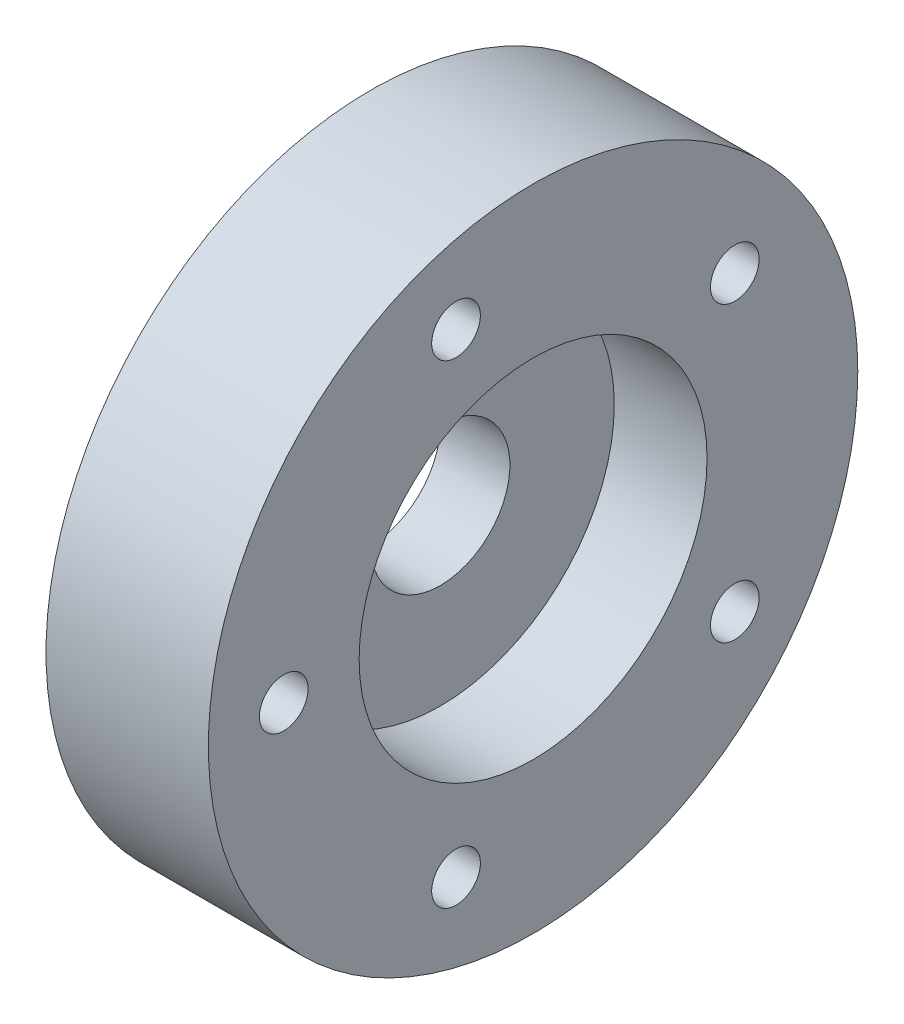
ISO-10303-21;
HEADER;
FILE_DESCRIPTION(('STEP AP214'),'2;1');
FILE_NAME('part.step','',(''),(''),'','','');
FILE_SCHEMA(('AUTOMOTIVE_DESIGN { 1 0 10303 214 1 1 1 1 }'));
ENDSEC;
DATA;
#1=APPLICATION_CONTEXT('core data for automotive mechanical design processes');
#2=APPLICATION_PROTOCOL_DEFINITION('international standard','automotive_design',2000,#1);
#3=PRODUCT_CONTEXT('',#1,'mechanical');
#4=PRODUCT('Part','Part','',(#3));
#5=PRODUCT_RELATED_PRODUCT_CATEGORY('part','',(#4));
#6=PRODUCT_DEFINITION_FORMATION('','',#4);
#7=PRODUCT_DEFINITION_CONTEXT('part definition',#1,'design');
#8=PRODUCT_DEFINITION('design','',#6,#7);
#9=PRODUCT_DEFINITION_SHAPE('','',#8);
#10=(LENGTH_UNIT() NAMED_UNIT(*) SI_UNIT(.MILLI.,.METRE.));
#11=(NAMED_UNIT(*) PLANE_ANGLE_UNIT() SI_UNIT($,.RADIAN.));
#12=(NAMED_UNIT(*) SI_UNIT($,.STERADIAN.) SOLID_ANGLE_UNIT());
#13=UNCERTAINTY_MEASURE_WITH_UNIT(LENGTH_MEASURE(1.E-05),#10,'distance_accuracy_value','');
#14=(GEOMETRIC_REPRESENTATION_CONTEXT(3) GLOBAL_UNCERTAINTY_ASSIGNED_CONTEXT((#13)) GLOBAL_UNIT_ASSIGNED_CONTEXT((#10,
#11,#12)) REPRESENTATION_CONTEXT('',''));
#15=CARTESIAN_POINT('',(0.,0.,0.));
#16=DIRECTION('',(0.,0.,1.));
#17=DIRECTION('',(1.,0.,0.));
#18=AXIS2_PLACEMENT_3D('',#15,#16,#17);
#19=CARTESIAN_POINT('',(14.,0.,0.));
#20=DIRECTION('',(-1.,0.,0.));
#21=DIRECTION('',(0.,0.,1.));
#22=AXIS2_PLACEMENT_3D('',#19,#20,#21);
#23=CYLINDRICAL_SURFACE('',#22,28.);
#24=CARTESIAN_POINT('',(14.,0.,0.));
#25=DIRECTION('',(1.,0.,0.));
#26=DIRECTION('',(0.,0.,-1.));
#27=AXIS2_PLACEMENT_3D('',#24,#25,#26);
#28=CIRCLE('',#27,28.);
#29=CARTESIAN_POINT('',(14.,0.,-28.));
#30=VERTEX_POINT('',#29);
#31=EDGE_CURVE('E185',#30,#30,#28,.T.);
#32=ORIENTED_EDGE('',*,*,#31,.F.);
#33=EDGE_LOOP('',(#32));
#34=FACE_BOUND('',#33,.T.);
#35=CARTESIAN_POINT('',(0.,0.,0.));
#36=DIRECTION('',(1.,0.,0.));
#37=DIRECTION('',(0.,0.,-1.));
#38=AXIS2_PLACEMENT_3D('',#35,#36,#37);
#39=CIRCLE('',#38,28.);
#40=CARTESIAN_POINT('',(0.,0.,-28.));
#41=VERTEX_POINT('',#40);
#42=EDGE_CURVE('E181',#41,#41,#39,.T.);
#43=ORIENTED_EDGE('',*,*,#42,.T.);
#44=EDGE_LOOP('',(#43));
#45=FACE_BOUND('',#44,.T.);
#46=ADVANCED_FACE('F47',(#34,#45),#23,.T.);
#47=CARTESIAN_POINT('',(14.,0.,0.));
#48=DIRECTION('',(1.,0.,0.));
#49=DIRECTION('',(0.,0.,-1.));
#50=AXIS2_PLACEMENT_3D('',#47,#48,#49);
#51=PLANE('',#50);
#52=CARTESIAN_POINT('',(14.,-20.4477151003457,6.6438653790616));
#53=DIRECTION('',(1.,0.,0.));
#54=DIRECTION('',(0.,0.,-1.));
#55=AXIS2_PLACEMENT_3D('',#52,#53,#54);
#56=CIRCLE('',#55,2.09999999999999);
#57=CARTESIAN_POINT('',(14.,-20.4477151003457,4.54386537906161));
#58=VERTEX_POINT('',#57);
#59=EDGE_CURVE('E113',#58,#58,#56,.T.);
#60=ORIENTED_EDGE('',*,*,#59,.F.);
#61=EDGE_LOOP('',(#60));
#62=FACE_BOUND('',#61,.T.);
#63=CARTESIAN_POINT('',(14.,0.,21.5));
#64=DIRECTION('',(1.,0.,0.));
#65=DIRECTION('',(0.,0.,-1.));
#66=AXIS2_PLACEMENT_3D('',#63,#64,#65);
#67=CIRCLE('',#66,2.09999999999999);
#68=CARTESIAN_POINT('',(14.,0.,19.4));
#69=VERTEX_POINT('',#68);
#70=EDGE_CURVE('E112',#69,#69,#67,.T.);
#71=ORIENTED_EDGE('',*,*,#70,.F.);
#72=EDGE_LOOP('',(#71));
#73=FACE_BOUND('',#72,.T.);
#74=CARTESIAN_POINT('',(14.,-12.6373829242883,-17.3938653790613));
#75=DIRECTION('',(1.,0.,0.));
#76=DIRECTION('',(0.,0.,-1.));
#77=AXIS2_PLACEMENT_3D('',#74,#75,#76);
#78=CIRCLE('',#77,2.09999999999999);
#79=CARTESIAN_POINT('',(14.,-12.6373829242883,-19.4938653790612));
#80=VERTEX_POINT('',#79);
#81=EDGE_CURVE('E128',#80,#80,#78,.T.);
#82=ORIENTED_EDGE('',*,*,#81,.F.);
#83=EDGE_LOOP('',(#82));
#84=FACE_BOUND('',#83,.T.);
#85=CARTESIAN_POINT('',(14.,12.6373829242881,-17.3938653790614));
#86=DIRECTION('',(1.,0.,0.));
#87=DIRECTION('',(0.,0.,-1.));
#88=AXIS2_PLACEMENT_3D('',#85,#86,#87);
#89=CIRCLE('',#88,2.09999999999999);
#90=CARTESIAN_POINT('',(14.,12.6373829242881,-19.4938653790614));
#91=VERTEX_POINT('',#90);
#92=EDGE_CURVE('E136',#91,#91,#89,.T.);
#93=ORIENTED_EDGE('',*,*,#92,.F.);
#94=EDGE_LOOP('',(#93));
#95=FACE_BOUND('',#94,.T.);
#96=CARTESIAN_POINT('',(14.,20.4477151003458,6.64386537906131));
#97=DIRECTION('',(1.,0.,0.));
#98=DIRECTION('',(0.,0.,-1.));
#99=AXIS2_PLACEMENT_3D('',#96,#97,#98);
#100=CIRCLE('',#99,2.09999999999999);
#101=CARTESIAN_POINT('',(14.,20.4477151003458,4.54386537906132));
#102=VERTEX_POINT('',#101);
#103=EDGE_CURVE('E144',#102,#102,#100,.T.);
#104=ORIENTED_EDGE('',*,*,#103,.F.);
#105=EDGE_LOOP('',(#104));
#106=FACE_BOUND('',#105,.T.);
#107=CARTESIAN_POINT('',(14.,0.,0.));
#108=DIRECTION('',(1.,0.,0.));
#109=DIRECTION('',(0.,0.,-1.));
#110=AXIS2_PLACEMENT_3D('',#107,#108,#109);
#111=CIRCLE('',#110,15.);
#112=CARTESIAN_POINT('',(14.,0.,-15.));
#113=VERTEX_POINT('',#112);
#114=EDGE_CURVE('E169',#113,#113,#111,.T.);
#115=ORIENTED_EDGE('',*,*,#114,.F.);
#116=EDGE_LOOP('',(#115));
#117=FACE_BOUND('',#116,.T.);
#118=ORIENTED_EDGE('',*,*,#31,.T.);
#119=EDGE_LOOP('',(#118));
#120=FACE_BOUND('',#119,.T.);
#121=ADVANCED_FACE('F223',(#62,#73,#84,#95,#106,#117,#120),#51,.T.);
#122=CARTESIAN_POINT('',(0.,0.,0.));
#123=DIRECTION('',(1.,0.,0.));
#124=DIRECTION('',(0.,0.,-1.));
#125=AXIS2_PLACEMENT_3D('',#122,#123,#124);
#126=PLANE('',#125);
#127=DIRECTION('',(0.,1.,0.));
#128=VECTOR('',#127,1.);
#129=CARTESIAN_POINT('',(0.,2.,7.5));
#130=LINE('',#129,#128);
#131=CARTESIAN_POINT('',(0.,-2.,7.5));
#132=VERTEX_POINT('',#131);
#133=CARTESIAN_POINT('',(0.,2.,7.5));
#134=VERTEX_POINT('',#133);
#135=EDGE_CURVE('E154',#132,#134,#130,.T.);
#136=ORIENTED_EDGE('',*,*,#135,.F.);
#137=DIRECTION('',(0.,0.,1.));
#138=VECTOR('',#137,1.);
#139=CARTESIAN_POINT('',(0.,-2.,7.5));
#140=LINE('',#139,#138);
#141=CARTESIAN_POINT('',(0.,-2.,5.65685424949238));
#142=VERTEX_POINT('',#141);
#143=EDGE_CURVE('E62',#142,#132,#140,.T.);
#144=ORIENTED_EDGE('',*,*,#143,.F.);
#145=CARTESIAN_POINT('',(0.,0.,0.));
#146=DIRECTION('',(-1.,0.,0.));
#147=DIRECTION('',(0.,0.,1.));
#148=AXIS2_PLACEMENT_3D('',#145,#146,#147);
#149=CIRCLE('',#148,6.);
#150=CARTESIAN_POINT('',(0.,2.,5.65685424949238));
#151=VERTEX_POINT('',#150);
#152=EDGE_CURVE('E161',#151,#142,#149,.T.);
#153=ORIENTED_EDGE('',*,*,#152,.F.);
#154=DIRECTION('',(0.,0.,-1.));
#155=VECTOR('',#154,1.);
#156=CARTESIAN_POINT('',(0.,2.,7.5));
#157=LINE('',#156,#155);
#158=EDGE_CURVE('E157',#134,#151,#157,.T.);
#159=ORIENTED_EDGE('',*,*,#158,.F.);
#160=EDGE_LOOP('',(#136,#144,#153,#159));
#161=FACE_BOUND('',#160,.T.);
#162=ORIENTED_EDGE('',*,*,#42,.F.);
#163=EDGE_LOOP('',(#162));
#164=FACE_BOUND('',#163,.T.);
#165=ADVANCED_FACE('F219',(#161,#164),#126,.F.);
#166=CARTESIAN_POINT('',(6.,0.,0.));
#167=DIRECTION('',(1.,0.,0.));
#168=DIRECTION('',(0.,0.,-1.));
#169=AXIS2_PLACEMENT_3D('',#166,#167,#168);
#170=CYLINDRICAL_SURFACE('',#169,15.);
#171=CARTESIAN_POINT('',(6.,0.,0.));
#172=DIRECTION('',(1.,0.,0.));
#173=DIRECTION('',(0.,0.,-1.));
#174=AXIS2_PLACEMENT_3D('',#171,#172,#173);
#175=CIRCLE('',#174,15.);
#176=CARTESIAN_POINT('',(6.,0.,-15.));
#177=VERTEX_POINT('',#176);
#178=EDGE_CURVE('E177',#177,#177,#175,.T.);
#179=ORIENTED_EDGE('',*,*,#178,.F.);
#180=EDGE_LOOP('',(#179));
#181=FACE_BOUND('',#180,.T.);
#182=ORIENTED_EDGE('',*,*,#114,.T.);
#183=EDGE_LOOP('',(#182));
#184=FACE_BOUND('',#183,.T.);
#185=ADVANCED_FACE('F222',(#181,#184),#170,.F.);
#186=CARTESIAN_POINT('',(6.,0.,0.));
#187=DIRECTION('',(1.,0.,0.));
#188=DIRECTION('',(0.,0.,-1.));
#189=AXIS2_PLACEMENT_3D('',#186,#187,#188);
#190=PLANE('',#189);
#191=DIRECTION('',(0.,0.,-1.));
#192=VECTOR('',#191,1.);
#193=CARTESIAN_POINT('',(6.,-2.,0.));
#194=LINE('',#193,#192);
#195=CARTESIAN_POINT('',(6.,-2.,7.5));
#196=VERTEX_POINT('',#195);
#197=CARTESIAN_POINT('',(6.,-2.,5.65685424949238));
#198=VERTEX_POINT('',#197);
#199=EDGE_CURVE('E11',#196,#198,#194,.T.);
#200=ORIENTED_EDGE('',*,*,#199,.F.);
#201=DIRECTION('',(0.,-1.,0.));
#202=VECTOR('',#201,1.);
#203=CARTESIAN_POINT('',(6.,0.,7.5));
#204=LINE('',#203,#202);
#205=CARTESIAN_POINT('',(6.,2.,7.5));
#206=VERTEX_POINT('',#205);
#207=EDGE_CURVE('E189',#206,#196,#204,.T.);
#208=ORIENTED_EDGE('',*,*,#207,.F.);
#209=DIRECTION('',(0.,0.,1.));
#210=VECTOR('',#209,1.);
#211=CARTESIAN_POINT('',(6.,2.,0.));
#212=LINE('',#211,#210);
#213=CARTESIAN_POINT('',(6.,2.,5.65685424949238));
#214=VERTEX_POINT('',#213);
#215=EDGE_CURVE('E195',#214,#206,#212,.T.);
#216=ORIENTED_EDGE('',*,*,#215,.F.);
#217=CARTESIAN_POINT('',(6.,0.,0.));
#218=DIRECTION('',(1.,0.,0.));
#219=DIRECTION('',(0.,0.,-1.));
#220=AXIS2_PLACEMENT_3D('',#217,#218,#219);
#221=CIRCLE('',#220,6.);
#222=EDGE_CURVE('E55',#198,#214,#221,.T.);
#223=ORIENTED_EDGE('',*,*,#222,.F.);
#224=EDGE_LOOP('',(#200,#208,#216,#223));
#225=FACE_BOUND('',#224,.T.);
#226=ORIENTED_EDGE('',*,*,#178,.T.);
#227=EDGE_LOOP('',(#226));
#228=FACE_BOUND('',#227,.T.);
#229=ADVANCED_FACE('F213',(#225,#228),#190,.T.);
#230=CARTESIAN_POINT('',(16.,-2.,7.5));
#231=DIRECTION('',(0.,-1.,0.));
#232=DIRECTION('',(0.,0.,-1.));
#233=AXIS2_PLACEMENT_3D('',#230,#231,#232);
#234=PLANE('',#233);
#235=ORIENTED_EDGE('',*,*,#199,.T.);
#236=DIRECTION('',(-1.,0.,0.));
#237=VECTOR('',#236,1.);
#238=CARTESIAN_POINT('',(16.,-2.,5.65685424949238));
#239=LINE('',#238,#237);
#240=EDGE_CURVE('E166',#198,#142,#239,.T.);
#241=ORIENTED_EDGE('',*,*,#240,.T.);
#242=ORIENTED_EDGE('',*,*,#143,.T.);
#243=DIRECTION('',(-1.,0.,0.));
#244=VECTOR('',#243,1.);
#245=CARTESIAN_POINT('',(16.,-2.,7.5));
#246=LINE('',#245,#244);
#247=EDGE_CURVE('E165',#196,#132,#246,.T.);
#248=ORIENTED_EDGE('',*,*,#247,.F.);
#249=EDGE_LOOP('',(#235,#241,#242,#248));
#250=FACE_BOUND('',#249,.T.);
#251=ADVANCED_FACE('F217',(#250),#234,.F.);
#252=CARTESIAN_POINT('',(16.,0.,0.));
#253=DIRECTION('',(-1.,0.,0.));
#254=DIRECTION('',(0.,0.,1.));
#255=AXIS2_PLACEMENT_3D('',#252,#253,#254);
#256=CYLINDRICAL_SURFACE('',#255,6.);
#257=ORIENTED_EDGE('',*,*,#222,.T.);
#258=DIRECTION('',(-1.,0.,0.));
#259=VECTOR('',#258,1.);
#260=CARTESIAN_POINT('',(16.,2.,5.65685424949238));
#261=LINE('',#260,#259);
#262=EDGE_CURVE('E170',#214,#151,#261,.T.);
#263=ORIENTED_EDGE('',*,*,#262,.T.);
#264=ORIENTED_EDGE('',*,*,#152,.T.);
#265=ORIENTED_EDGE('',*,*,#240,.F.);
#266=EDGE_LOOP('',(#257,#263,#264,#265));
#267=FACE_BOUND('',#266,.T.);
#268=ADVANCED_FACE('F204',(#267),#256,.F.);
#269=CARTESIAN_POINT('',(16.,2.,7.5));
#270=DIRECTION('',(0.,1.,0.));
#271=DIRECTION('',(0.,0.,1.));
#272=AXIS2_PLACEMENT_3D('',#269,#270,#271);
#273=PLANE('',#272);
#274=ORIENTED_EDGE('',*,*,#215,.T.);
#275=DIRECTION('',(-1.,0.,0.));
#276=VECTOR('',#275,1.);
#277=CARTESIAN_POINT('',(16.,2.,7.5));
#278=LINE('',#277,#276);
#279=EDGE_CURVE('E70',#206,#134,#278,.T.);
#280=ORIENTED_EDGE('',*,*,#279,.T.);
#281=ORIENTED_EDGE('',*,*,#158,.T.);
#282=ORIENTED_EDGE('',*,*,#262,.F.);
#283=EDGE_LOOP('',(#274,#280,#281,#282));
#284=FACE_BOUND('',#283,.T.);
#285=ADVANCED_FACE('F209',(#284),#273,.F.);
#286=CARTESIAN_POINT('',(16.,2.,7.5));
#287=DIRECTION('',(0.,0.,1.));
#288=DIRECTION('',(0.,-1.,0.));
#289=AXIS2_PLACEMENT_3D('',#286,#287,#288);
#290=PLANE('',#289);
#291=ORIENTED_EDGE('',*,*,#207,.T.);
#292=ORIENTED_EDGE('',*,*,#247,.T.);
#293=ORIENTED_EDGE('',*,*,#135,.T.);
#294=ORIENTED_EDGE('',*,*,#279,.F.);
#295=EDGE_LOOP('',(#291,#292,#293,#294));
#296=FACE_BOUND('',#295,.T.);
#297=ADVANCED_FACE('F215',(#296),#290,.F.);
#298=CARTESIAN_POINT('',(6.,20.4477151003458,6.64386537906131));
#299=DIRECTION('',(1.,0.,0.));
#300=DIRECTION('',(0.,0.,-1.));
#301=AXIS2_PLACEMENT_3D('',#298,#299,#300);
#302=CONICAL_SURFACE('',#301,2.1,1.02974425867665);
#303=CARTESIAN_POINT('',(4.73819270004212,20.4477151003458,6.64386537906131));
#304=VERTEX_POINT('',#303);
#305=VERTEX_LOOP('',#304);
#306=FACE_BOUND('',#305,.T.);
#307=CARTESIAN_POINT('',(6.,20.4477151003458,6.64386537906131));
#308=DIRECTION('',(1.,0.,0.));
#309=DIRECTION('',(0.,0.,-1.));
#310=AXIS2_PLACEMENT_3D('',#307,#308,#309);
#311=CIRCLE('',#310,2.1);
#312=CARTESIAN_POINT('',(6.,20.4477151003458,4.54386537906132));
#313=VERTEX_POINT('',#312);
#314=EDGE_CURVE('E148',#313,#313,#311,.T.);
#315=ORIENTED_EDGE('',*,*,#314,.T.);
#316=EDGE_LOOP('',(#315));
#317=FACE_BOUND('',#316,.T.);
#318=ADVANCED_FACE('F250',(#306,#317),#302,.F.);
#319=CARTESIAN_POINT('',(14.,20.4477151003458,6.64386537906131));
#320=DIRECTION('',(1.,0.,0.));
#321=DIRECTION('',(0.,0.,-1.));
#322=AXIS2_PLACEMENT_3D('',#319,#320,#321);
#323=CYLINDRICAL_SURFACE('',#322,2.09999999999999);
#324=ORIENTED_EDGE('',*,*,#314,.F.);
#325=EDGE_LOOP('',(#324));
#326=FACE_BOUND('',#325,.T.);
#327=ORIENTED_EDGE('',*,*,#103,.T.);
#328=EDGE_LOOP('',(#327));
#329=FACE_BOUND('',#328,.T.);
#330=ADVANCED_FACE('F256',(#326,#329),#323,.F.);
#331=CARTESIAN_POINT('',(6.,12.6373829242881,-17.3938653790614));
#332=DIRECTION('',(1.,0.,0.));
#333=DIRECTION('',(0.,0.,-1.));
#334=AXIS2_PLACEMENT_3D('',#331,#332,#333);
#335=CONICAL_SURFACE('',#334,2.1,1.02974425867665);
#336=CARTESIAN_POINT('',(4.73819270004212,12.6373829242881,-17.3938653790614));
#337=VERTEX_POINT('',#336);
#338=VERTEX_LOOP('',#337);
#339=FACE_BOUND('',#338,.T.);
#340=CARTESIAN_POINT('',(6.,12.6373829242881,-17.3938653790614));
#341=DIRECTION('',(1.,0.,0.));
#342=DIRECTION('',(0.,0.,-1.));
#343=AXIS2_PLACEMENT_3D('',#340,#341,#342);
#344=CIRCLE('',#343,2.1);
#345=CARTESIAN_POINT('',(6.,12.6373829242881,-19.4938653790614));
#346=VERTEX_POINT('',#345);
#347=EDGE_CURVE('E140',#346,#346,#344,.T.);
#348=ORIENTED_EDGE('',*,*,#347,.T.);
#349=EDGE_LOOP('',(#348));
#350=FACE_BOUND('',#349,.T.);
#351=ADVANCED_FACE('F260',(#339,#350),#335,.F.);
#352=CARTESIAN_POINT('',(14.,12.6373829242881,-17.3938653790614));
#353=DIRECTION('',(1.,0.,0.));
#354=DIRECTION('',(0.,0.,-1.));
#355=AXIS2_PLACEMENT_3D('',#352,#353,#354);
#356=CYLINDRICAL_SURFACE('',#355,2.09999999999999);
#357=ORIENTED_EDGE('',*,*,#347,.F.);
#358=EDGE_LOOP('',(#357));
#359=FACE_BOUND('',#358,.T.);
#360=ORIENTED_EDGE('',*,*,#92,.T.);
#361=EDGE_LOOP('',(#360));
#362=FACE_BOUND('',#361,.T.);
#363=ADVANCED_FACE('F264',(#359,#362),#356,.F.);
#364=CARTESIAN_POINT('',(6.,-12.6373829242883,-17.3938653790613));
#365=DIRECTION('',(1.,0.,0.));
#366=DIRECTION('',(0.,0.,-1.));
#367=AXIS2_PLACEMENT_3D('',#364,#365,#366);
#368=CONICAL_SURFACE('',#367,2.1,1.02974425867665);
#369=CARTESIAN_POINT('',(4.73819270004212,-12.6373829242883,-17.3938653790613));
#370=VERTEX_POINT('',#369);
#371=VERTEX_LOOP('',#370);
#372=FACE_BOUND('',#371,.T.);
#373=CARTESIAN_POINT('',(6.,-12.6373829242883,-17.3938653790613));
#374=DIRECTION('',(1.,0.,0.));
#375=DIRECTION('',(0.,0.,-1.));
#376=AXIS2_PLACEMENT_3D('',#373,#374,#375);
#377=CIRCLE('',#376,2.1);
#378=CARTESIAN_POINT('',(6.,-12.6373829242883,-19.4938653790613));
#379=VERTEX_POINT('',#378);
#380=EDGE_CURVE('E132',#379,#379,#377,.T.);
#381=ORIENTED_EDGE('',*,*,#380,.T.);
#382=EDGE_LOOP('',(#381));
#383=FACE_BOUND('',#382,.T.);
#384=ADVANCED_FACE('F268',(#372,#383),#368,.F.);
#385=CARTESIAN_POINT('',(14.,-12.6373829242883,-17.3938653790613));
#386=DIRECTION('',(1.,0.,0.));
#387=DIRECTION('',(0.,0.,-1.));
#388=AXIS2_PLACEMENT_3D('',#385,#386,#387);
#389=CYLINDRICAL_SURFACE('',#388,2.09999999999999);
#390=ORIENTED_EDGE('',*,*,#380,.F.);
#391=EDGE_LOOP('',(#390));
#392=FACE_BOUND('',#391,.T.);
#393=ORIENTED_EDGE('',*,*,#81,.T.);
#394=EDGE_LOOP('',(#393));
#395=FACE_BOUND('',#394,.T.);
#396=ADVANCED_FACE('F272',(#392,#395),#389,.F.);
#397=CARTESIAN_POINT('',(6.,0.,21.5));
#398=DIRECTION('',(1.,0.,0.));
#399=DIRECTION('',(0.,0.,-1.));
#400=AXIS2_PLACEMENT_3D('',#397,#398,#399);
#401=CONICAL_SURFACE('',#400,2.1,1.02974425867665);
#402=CARTESIAN_POINT('',(4.73819270004212,0.,21.5));
#403=VERTEX_POINT('',#402);
#404=VERTEX_LOOP('',#403);
#405=FACE_BOUND('',#404,.T.);
#406=CARTESIAN_POINT('',(6.,0.,21.5));
#407=DIRECTION('',(1.,0.,0.));
#408=DIRECTION('',(0.,0.,-1.));
#409=AXIS2_PLACEMENT_3D('',#406,#407,#408);
#410=CIRCLE('',#409,2.1);
#411=CARTESIAN_POINT('',(6.,0.,19.4));
#412=VERTEX_POINT('',#411);
#413=EDGE_CURVE('E120',#412,#412,#410,.T.);
#414=ORIENTED_EDGE('',*,*,#413,.T.);
#415=EDGE_LOOP('',(#414));
#416=FACE_BOUND('',#415,.T.);
#417=ADVANCED_FACE('F276',(#405,#416),#401,.F.);
#418=CARTESIAN_POINT('',(14.,0.,21.5));
#419=DIRECTION('',(1.,0.,0.));
#420=DIRECTION('',(0.,0.,-1.));
#421=AXIS2_PLACEMENT_3D('',#418,#419,#420);
#422=CYLINDRICAL_SURFACE('',#421,2.09999999999999);
#423=ORIENTED_EDGE('',*,*,#413,.F.);
#424=EDGE_LOOP('',(#423));
#425=FACE_BOUND('',#424,.T.);
#426=ORIENTED_EDGE('',*,*,#70,.T.);
#427=EDGE_LOOP('',(#426));
#428=FACE_BOUND('',#427,.T.);
#429=ADVANCED_FACE('F105',(#425,#428),#422,.F.);
#430=CARTESIAN_POINT('',(6.,-20.4477151003457,6.6438653790616));
#431=DIRECTION('',(1.,0.,0.));
#432=DIRECTION('',(0.,0.,-1.));
#433=AXIS2_PLACEMENT_3D('',#430,#431,#432);
#434=CONICAL_SURFACE('',#433,2.1,1.02974425867665);
#435=CARTESIAN_POINT('',(4.73819270004212,-20.4477151003457,6.6438653790616));
#436=VERTEX_POINT('',#435);
#437=VERTEX_LOOP('',#436);
#438=FACE_BOUND('',#437,.T.);
#439=CARTESIAN_POINT('',(6.,-20.4477151003457,6.6438653790616));
#440=DIRECTION('',(1.,0.,0.));
#441=DIRECTION('',(0.,0.,-1.));
#442=AXIS2_PLACEMENT_3D('',#439,#440,#441);
#443=CIRCLE('',#442,2.1);
#444=CARTESIAN_POINT('',(6.,-20.4477151003457,4.5438653790616));
#445=VERTEX_POINT('',#444);
#446=EDGE_CURVE('E109',#445,#445,#443,.T.);
#447=ORIENTED_EDGE('',*,*,#446,.T.);
#448=EDGE_LOOP('',(#447));
#449=FACE_BOUND('',#448,.T.);
#450=ADVANCED_FACE('F101',(#438,#449),#434,.F.);
#451=CARTESIAN_POINT('',(14.,-20.4477151003457,6.6438653790616));
#452=DIRECTION('',(1.,0.,0.));
#453=DIRECTION('',(0.,0.,-1.));
#454=AXIS2_PLACEMENT_3D('',#451,#452,#453);
#455=CYLINDRICAL_SURFACE('',#454,2.09999999999999);
#456=ORIENTED_EDGE('',*,*,#446,.F.);
#457=EDGE_LOOP('',(#456));
#458=FACE_BOUND('',#457,.T.);
#459=ORIENTED_EDGE('',*,*,#59,.T.);
#460=EDGE_LOOP('',(#459));
#461=FACE_BOUND('',#460,.T.);
#462=ADVANCED_FACE('F104',(#458,#461),#455,.F.);
#463=CLOSED_SHELL('',(#46,#121,#165,#185,#229,#251,#268,#285,#297,#318,#330,#351,#363,#384,#396,
#417,#429,#450,#462));
#464=MANIFOLD_SOLID_BREP('B2',#463);
#465=ADVANCED_BREP_SHAPE_REPRESENTATION('',(#18,#464),#14);
#466=SHAPE_DEFINITION_REPRESENTATION(#9,#465);
ENDSEC;
END-ISO-10303-21;
